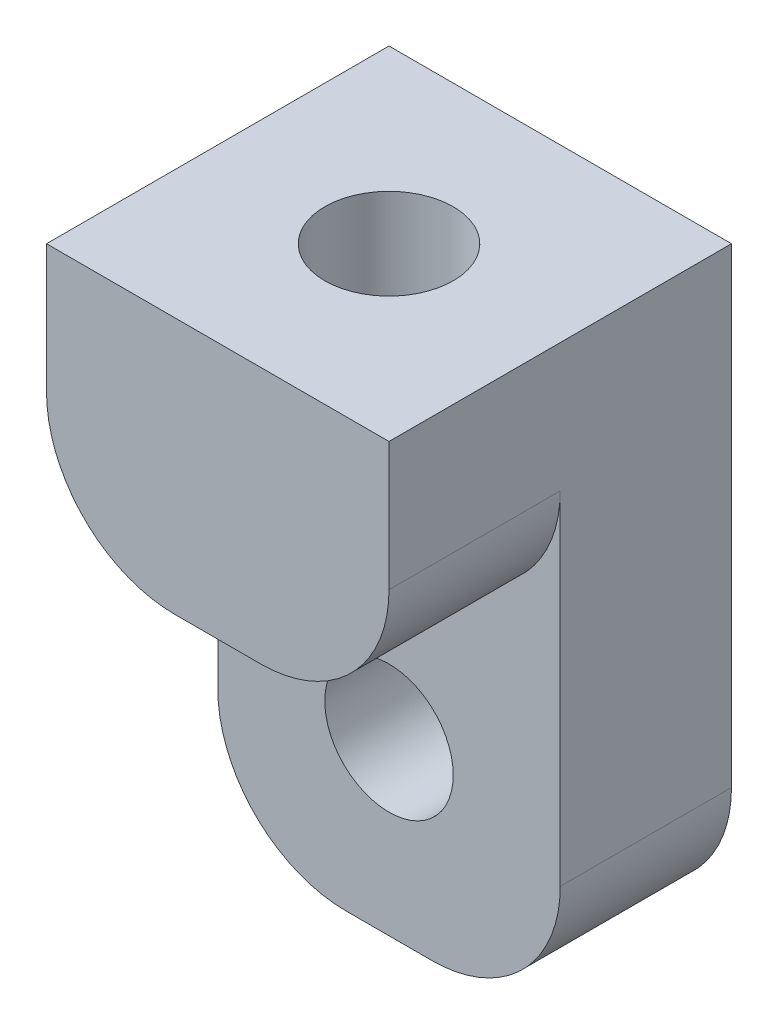
ISO-10303-21;
HEADER;
FILE_DESCRIPTION(('STEP AP214'),'2;1');
FILE_NAME('part.step','',(''),(''),'','','');
FILE_SCHEMA(('AUTOMOTIVE_DESIGN { 1 0 10303 214 1 1 1 1 }'));
ENDSEC;
DATA;
#1=APPLICATION_CONTEXT('core data for automotive mechanical design processes');
#2=APPLICATION_PROTOCOL_DEFINITION('international standard','automotive_design',2000,#1);
#3=PRODUCT_CONTEXT('',#1,'mechanical');
#4=PRODUCT('Part','Part','',(#3));
#5=PRODUCT_RELATED_PRODUCT_CATEGORY('part','',(#4));
#6=PRODUCT_DEFINITION_FORMATION('','',#4);
#7=PRODUCT_DEFINITION_CONTEXT('part definition',#1,'design');
#8=PRODUCT_DEFINITION('design','',#6,#7);
#9=PRODUCT_DEFINITION_SHAPE('','',#8);
#10=(LENGTH_UNIT() NAMED_UNIT(*) SI_UNIT(.MILLI.,.METRE.));
#11=(NAMED_UNIT(*) PLANE_ANGLE_UNIT() SI_UNIT($,.RADIAN.));
#12=(NAMED_UNIT(*) SI_UNIT($,.STERADIAN.) SOLID_ANGLE_UNIT());
#13=UNCERTAINTY_MEASURE_WITH_UNIT(LENGTH_MEASURE(1.E-05),#10,'distance_accuracy_value','');
#14=(GEOMETRIC_REPRESENTATION_CONTEXT(3) GLOBAL_UNCERTAINTY_ASSIGNED_CONTEXT((#13)) GLOBAL_UNIT_ASSIGNED_CONTEXT((#10,
#11,#12)) REPRESENTATION_CONTEXT('',''));
#15=CARTESIAN_POINT('',(0.,0.,0.));
#16=DIRECTION('',(0.,0.,1.));
#17=DIRECTION('',(1.,0.,0.));
#18=AXIS2_PLACEMENT_3D('',#15,#16,#17);
#19=CARTESIAN_POINT('',(0.,0.,40.));
#20=DIRECTION('',(0.,0.,1.));
#21=DIRECTION('',(1.,0.,0.));
#22=AXIS2_PLACEMENT_3D('',#19,#20,#21);
#23=PLANE('',#22);
#24=DIRECTION('',(0.,-1.,0.));
#25=VECTOR('',#24,1.);
#26=CARTESIAN_POINT('',(-20.,50.,40.));
#27=LINE('',#26,#25);
#28=CARTESIAN_POINT('',(-20.,50.,40.));
#29=VERTEX_POINT('',#28);
#30=CARTESIAN_POINT('',(-20.,35.,40.));
#31=VERTEX_POINT('',#30);
#32=EDGE_CURVE('E124',#29,#31,#27,.T.);
#33=ORIENTED_EDGE('',*,*,#32,.T.);
#34=CARTESIAN_POINT('',(-5.00000000000001,35.,40.));
#35=DIRECTION('',(0.,0.,1.));
#36=DIRECTION('',(1.,0.,0.));
#37=AXIS2_PLACEMENT_3D('',#34,#35,#36);
#38=CIRCLE('',#37,15.);
#39=CARTESIAN_POINT('',(-5.00000000000001,20.,40.));
#40=VERTEX_POINT('',#39);
#41=EDGE_CURVE('E163',#31,#40,#38,.T.);
#42=ORIENTED_EDGE('',*,*,#41,.T.);
#43=DIRECTION('',(1.,0.,0.));
#44=VECTOR('',#43,1.);
#45=CARTESIAN_POINT('',(-20.,20.,40.));
#46=LINE('',#45,#44);
#47=CARTESIAN_POINT('',(5.00000000000001,20.,40.));
#48=VERTEX_POINT('',#47);
#49=EDGE_CURVE('E205',#40,#48,#46,.T.);
#50=ORIENTED_EDGE('',*,*,#49,.T.);
#51=CARTESIAN_POINT('',(5.00000000000001,35.,40.));
#52=DIRECTION('',(0.,0.,1.));
#53=DIRECTION('',(1.,0.,0.));
#54=AXIS2_PLACEMENT_3D('',#51,#52,#53);
#55=CIRCLE('',#54,15.);
#56=CARTESIAN_POINT('',(20.,35.,40.));
#57=VERTEX_POINT('',#56);
#58=EDGE_CURVE('E120',#48,#57,#55,.T.);
#59=ORIENTED_EDGE('',*,*,#58,.T.);
#60=DIRECTION('',(0.,1.,0.));
#61=VECTOR('',#60,1.);
#62=CARTESIAN_POINT('',(20.,50.,40.));
#63=LINE('',#62,#61);
#64=CARTESIAN_POINT('',(20.,50.,40.));
#65=VERTEX_POINT('',#64);
#66=EDGE_CURVE('E113',#57,#65,#63,.T.);
#67=ORIENTED_EDGE('',*,*,#66,.T.);
#68=DIRECTION('',(-1.,0.,0.));
#69=VECTOR('',#68,1.);
#70=CARTESIAN_POINT('',(-20.,50.,40.));
#71=LINE('',#70,#69);
#72=EDGE_CURVE('E117',#65,#29,#71,.T.);
#73=ORIENTED_EDGE('',*,*,#72,.T.);
#74=EDGE_LOOP('',(#33,#42,#50,#59,#67,#73));
#75=FACE_BOUND('',#74,.T.);
#76=ADVANCED_FACE('F36',(#75),#23,.T.);
#77=CARTESIAN_POINT('',(-20.,50.,40.));
#78=DIRECTION('',(1.,0.,0.));
#79=DIRECTION('',(0.,1.,0.));
#80=AXIS2_PLACEMENT_3D('',#77,#78,#79);
#81=PLANE('',#80);
#82=DIRECTION('',(0.,1.,0.));
#83=VECTOR('',#82,1.);
#84=CARTESIAN_POINT('',(-20.,-20.,20.));
#85=LINE('',#84,#83);
#86=CARTESIAN_POINT('',(-20.,-5.,20.));
#87=VERTEX_POINT('',#86);
#88=CARTESIAN_POINT('',(-20.,35.,20.));
#89=VERTEX_POINT('',#88);
#90=EDGE_CURVE('E157',#87,#89,#85,.T.);
#91=ORIENTED_EDGE('',*,*,#90,.T.);
#92=DIRECTION('',(0.,0.,1.));
#93=VECTOR('',#92,1.);
#94=CARTESIAN_POINT('',(-20.,35.,40.));
#95=LINE('',#94,#93);
#96=EDGE_CURVE('E159',#89,#31,#95,.T.);
#97=ORIENTED_EDGE('',*,*,#96,.T.);
#98=ORIENTED_EDGE('',*,*,#32,.F.);
#99=DIRECTION('',(0.,0.,-1.));
#100=VECTOR('',#99,1.);
#101=CARTESIAN_POINT('',(-20.,50.,40.));
#102=LINE('',#101,#100);
#103=CARTESIAN_POINT('',(-20.,50.,0.));
#104=VERTEX_POINT('',#103);
#105=EDGE_CURVE('E135',#29,#104,#102,.T.);
#106=ORIENTED_EDGE('',*,*,#105,.T.);
#107=DIRECTION('',(0.,-1.,0.));
#108=VECTOR('',#107,1.);
#109=CARTESIAN_POINT('',(-20.,50.,0.));
#110=LINE('',#109,#108);
#111=CARTESIAN_POINT('',(-20.,-5.,0.));
#112=VERTEX_POINT('',#111);
#113=EDGE_CURVE('E144',#104,#112,#110,.T.);
#114=ORIENTED_EDGE('',*,*,#113,.T.);
#115=DIRECTION('',(0.,0.,-1.));
#116=VECTOR('',#115,1.);
#117=CARTESIAN_POINT('',(-20.,-5.,40.));
#118=LINE('',#117,#116);
#119=EDGE_CURVE('E134',#112,#87,#118,.F.);
#120=ORIENTED_EDGE('',*,*,#119,.T.);
#121=EDGE_LOOP('',(#91,#97,#98,#106,#114,#120));
#122=FACE_BOUND('',#121,.T.);
#123=ADVANCED_FACE('F195',(#122),#81,.F.);
#124=CARTESIAN_POINT('',(-20.,-20.,40.));
#125=DIRECTION('',(0.,1.,0.));
#126=DIRECTION('',(0.,0.,1.));
#127=AXIS2_PLACEMENT_3D('',#124,#125,#126);
#128=PLANE('',#127);
#129=DIRECTION('',(1.,0.,0.));
#130=VECTOR('',#129,1.);
#131=CARTESIAN_POINT('',(-20.,-20.,0.));
#132=LINE('',#131,#130);
#133=CARTESIAN_POINT('',(-5.,-20.,0.));
#134=VERTEX_POINT('',#133);
#135=CARTESIAN_POINT('',(5.,-20.,0.));
#136=VERTEX_POINT('',#135);
#137=EDGE_CURVE('E147',#134,#136,#132,.T.);
#138=ORIENTED_EDGE('',*,*,#137,.T.);
#139=DIRECTION('',(0.,0.,-1.));
#140=VECTOR('',#139,1.);
#141=CARTESIAN_POINT('',(5.,-20.,40.));
#142=LINE('',#141,#140);
#143=CARTESIAN_POINT('',(5.,-20.,20.));
#144=VERTEX_POINT('',#143);
#145=EDGE_CURVE('E51',#136,#144,#142,.F.);
#146=ORIENTED_EDGE('',*,*,#145,.T.);
#147=DIRECTION('',(1.,0.,0.));
#148=VECTOR('',#147,1.);
#149=CARTESIAN_POINT('',(-20.,-20.,20.));
#150=LINE('',#149,#148);
#151=CARTESIAN_POINT('',(-5.,-20.,20.));
#152=VERTEX_POINT('',#151);
#153=EDGE_CURVE('E207',#152,#144,#150,.T.);
#154=ORIENTED_EDGE('',*,*,#153,.F.);
#155=DIRECTION('',(0.,0.,-1.));
#156=VECTOR('',#155,1.);
#157=CARTESIAN_POINT('',(-5.,-20.,40.));
#158=LINE('',#157,#156);
#159=EDGE_CURVE('E178',#152,#134,#158,.T.);
#160=ORIENTED_EDGE('',*,*,#159,.T.);
#161=EDGE_LOOP('',(#138,#146,#154,#160));
#162=FACE_BOUND('',#161,.T.);
#163=ADVANCED_FACE('F225',(#162),#128,.F.);
#164=CARTESIAN_POINT('',(20.,50.,40.));
#165=DIRECTION('',(-1.,0.,0.));
#166=DIRECTION('',(0.,-1.,0.));
#167=AXIS2_PLACEMENT_3D('',#164,#165,#166);
#168=PLANE('',#167);
#169=ORIENTED_EDGE('',*,*,#66,.F.);
#170=DIRECTION('',(0.,0.,1.));
#171=VECTOR('',#170,1.);
#172=CARTESIAN_POINT('',(20.,35.,20.));
#173=LINE('',#172,#171);
#174=CARTESIAN_POINT('',(20.,35.,20.));
#175=VERTEX_POINT('',#174);
#176=EDGE_CURVE('E172',#57,#175,#173,.F.);
#177=ORIENTED_EDGE('',*,*,#176,.T.);
#178=DIRECTION('',(0.,1.,0.));
#179=VECTOR('',#178,1.);
#180=CARTESIAN_POINT('',(20.,-20.,20.));
#181=LINE('',#180,#179);
#182=CARTESIAN_POINT('',(20.,-5.00000000000001,20.));
#183=VERTEX_POINT('',#182);
#184=EDGE_CURVE('E210',#183,#175,#181,.T.);
#185=ORIENTED_EDGE('',*,*,#184,.F.);
#186=DIRECTION('',(0.,0.,-1.));
#187=VECTOR('',#186,1.);
#188=CARTESIAN_POINT('',(20.,-5.,40.));
#189=LINE('',#188,#187);
#190=CARTESIAN_POINT('',(20.,-5.,0.));
#191=VERTEX_POINT('',#190);
#192=EDGE_CURVE('E170',#183,#191,#189,.T.);
#193=ORIENTED_EDGE('',*,*,#192,.T.);
#194=DIRECTION('',(0.,1.,0.));
#195=VECTOR('',#194,1.);
#196=CARTESIAN_POINT('',(20.,50.,0.));
#197=LINE('',#196,#195);
#198=CARTESIAN_POINT('',(20.,50.,0.));
#199=VERTEX_POINT('',#198);
#200=EDGE_CURVE('E131',#191,#199,#197,.T.);
#201=ORIENTED_EDGE('',*,*,#200,.T.);
#202=DIRECTION('',(0.,0.,-1.));
#203=VECTOR('',#202,1.);
#204=CARTESIAN_POINT('',(20.,50.,40.));
#205=LINE('',#204,#203);
#206=EDGE_CURVE('E127',#65,#199,#205,.T.);
#207=ORIENTED_EDGE('',*,*,#206,.F.);
#208=EDGE_LOOP('',(#169,#177,#185,#193,#201,#207));
#209=FACE_BOUND('',#208,.T.);
#210=ADVANCED_FACE('F128',(#209),#168,.F.);
#211=CARTESIAN_POINT('',(0.,0.,40.));
#212=DIRECTION('',(0.,0.,-1.));
#213=DIRECTION('',(-1.,0.,0.));
#214=AXIS2_PLACEMENT_3D('',#211,#212,#213);
#215=CYLINDRICAL_SURFACE('',#214,7.5);
#216=CARTESIAN_POINT('',(0.,0.,0.));
#217=DIRECTION('',(0.,0.,1.));
#218=DIRECTION('',(1.,0.,0.));
#219=AXIS2_PLACEMENT_3D('',#216,#217,#218);
#220=CIRCLE('',#219,7.5);
#221=CARTESIAN_POINT('',(7.5,0.,0.));
#222=VERTEX_POINT('',#221);
#223=EDGE_CURVE('E148',#222,#222,#220,.T.);
#224=ORIENTED_EDGE('',*,*,#223,.F.);
#225=EDGE_LOOP('',(#224));
#226=FACE_BOUND('',#225,.T.);
#227=CARTESIAN_POINT('',(0.,0.,20.));
#228=DIRECTION('',(0.,0.,1.));
#229=DIRECTION('',(1.,0.,0.));
#230=AXIS2_PLACEMENT_3D('',#227,#228,#229);
#231=CIRCLE('',#230,7.5);
#232=CARTESIAN_POINT('',(7.5,0.,20.));
#233=VERTEX_POINT('',#232);
#234=EDGE_CURVE('E153',#233,#233,#231,.T.);
#235=ORIENTED_EDGE('',*,*,#234,.T.);
#236=EDGE_LOOP('',(#235));
#237=FACE_BOUND('',#236,.T.);
#238=ADVANCED_FACE('F232',(#226,#237),#215,.F.);
#239=CARTESIAN_POINT('',(0.,0.,0.));
#240=DIRECTION('',(0.,0.,1.));
#241=DIRECTION('',(1.,0.,0.));
#242=AXIS2_PLACEMENT_3D('',#239,#240,#241);
#243=PLANE('',#242);
#244=ORIENTED_EDGE('',*,*,#200,.F.);
#245=CARTESIAN_POINT('',(5.,-5.,0.));
#246=DIRECTION('',(0.,0.,1.));
#247=DIRECTION('',(1.,0.,0.));
#248=AXIS2_PLACEMENT_3D('',#245,#246,#247);
#249=CIRCLE('',#248,15.);
#250=EDGE_CURVE('E176',#191,#136,#249,.F.);
#251=ORIENTED_EDGE('',*,*,#250,.T.);
#252=ORIENTED_EDGE('',*,*,#137,.F.);
#253=CARTESIAN_POINT('',(-5.,-5.,0.));
#254=DIRECTION('',(0.,0.,1.));
#255=DIRECTION('',(1.,0.,0.));
#256=AXIS2_PLACEMENT_3D('',#253,#254,#255);
#257=CIRCLE('',#256,15.);
#258=EDGE_CURVE('E174',#134,#112,#257,.F.);
#259=ORIENTED_EDGE('',*,*,#258,.T.);
#260=ORIENTED_EDGE('',*,*,#113,.F.);
#261=DIRECTION('',(-1.,0.,0.));
#262=VECTOR('',#261,1.);
#263=CARTESIAN_POINT('',(-20.,50.,0.));
#264=LINE('',#263,#262);
#265=EDGE_CURVE('E151',#199,#104,#264,.T.);
#266=ORIENTED_EDGE('',*,*,#265,.F.);
#267=EDGE_LOOP('',(#244,#251,#252,#259,#260,#266));
#268=FACE_BOUND('',#267,.T.);
#269=ORIENTED_EDGE('',*,*,#223,.T.);
#270=EDGE_LOOP('',(#269));
#271=FACE_BOUND('',#270,.T.);
#272=ADVANCED_FACE('F219',(#268,#271),#243,.F.);
#273=CARTESIAN_POINT('',(-20.,50.,40.));
#274=DIRECTION('',(0.,-1.,0.));
#275=DIRECTION('',(0.,0.,-1.));
#276=AXIS2_PLACEMENT_3D('',#273,#274,#275);
#277=PLANE('',#276);
#278=CARTESIAN_POINT('',(0.,50.,20.));
#279=DIRECTION('',(0.,1.,0.));
#280=DIRECTION('',(0.,0.,1.));
#281=AXIS2_PLACEMENT_3D('',#278,#279,#280);
#282=CIRCLE('',#281,7.5);
#283=CARTESIAN_POINT('',(0.,50.,27.5));
#284=VERTEX_POINT('',#283);
#285=EDGE_CURVE('E156',#284,#284,#282,.T.);
#286=ORIENTED_EDGE('',*,*,#285,.F.);
#287=EDGE_LOOP('',(#286));
#288=FACE_BOUND('',#287,.T.);
#289=ORIENTED_EDGE('',*,*,#265,.T.);
#290=ORIENTED_EDGE('',*,*,#105,.F.);
#291=ORIENTED_EDGE('',*,*,#72,.F.);
#292=ORIENTED_EDGE('',*,*,#206,.T.);
#293=EDGE_LOOP('',(#289,#290,#291,#292));
#294=FACE_BOUND('',#293,.T.);
#295=ADVANCED_FACE('F137',(#288,#294),#277,.F.);
#296=CARTESIAN_POINT('',(0.,30.,20.));
#297=DIRECTION('',(0.,1.,0.));
#298=DIRECTION('',(0.,0.,1.));
#299=AXIS2_PLACEMENT_3D('',#296,#297,#298);
#300=CYLINDRICAL_SURFACE('',#299,7.5);
#301=CARTESIAN_POINT('',(0.,30.,20.));
#302=DIRECTION('',(0.,1.,0.));
#303=DIRECTION('',(0.,0.,1.));
#304=AXIS2_PLACEMENT_3D('',#301,#302,#303);
#305=CIRCLE('',#304,7.5);
#306=CARTESIAN_POINT('',(0.,30.,27.5));
#307=VERTEX_POINT('',#306);
#308=EDGE_CURVE('E200',#307,#307,#305,.T.);
#309=ORIENTED_EDGE('',*,*,#308,.F.);
#310=EDGE_LOOP('',(#309));
#311=FACE_BOUND('',#310,.T.);
#312=ORIENTED_EDGE('',*,*,#285,.T.);
#313=EDGE_LOOP('',(#312));
#314=FACE_BOUND('',#313,.T.);
#315=ADVANCED_FACE('F245',(#311,#314),#300,.F.);
#316=CARTESIAN_POINT('',(0.,30.,0.));
#317=DIRECTION('',(0.,1.,0.));
#318=DIRECTION('',(0.,0.,1.));
#319=AXIS2_PLACEMENT_3D('',#316,#317,#318);
#320=PLANE('',#319);
#321=ORIENTED_EDGE('',*,*,#308,.T.);
#322=EDGE_LOOP('',(#321));
#323=FACE_BOUND('',#322,.T.);
#324=ADVANCED_FACE('F250',(#323),#320,.T.);
#325=CARTESIAN_POINT('',(-20.,20.,20.));
#326=DIRECTION('',(0.,-1.,0.));
#327=DIRECTION('',(0.,0.,-1.));
#328=AXIS2_PLACEMENT_3D('',#325,#326,#327);
#329=PLANE('',#328);
#330=ORIENTED_EDGE('',*,*,#49,.F.);
#331=DIRECTION('',(0.,0.,1.));
#332=VECTOR('',#331,1.);
#333=CARTESIAN_POINT('',(-5.00000000000001,20.,20.));
#334=LINE('',#333,#332);
#335=CARTESIAN_POINT('',(-5.00000000000001,20.,20.));
#336=VERTEX_POINT('',#335);
#337=EDGE_CURVE('E168',#40,#336,#334,.F.);
#338=ORIENTED_EDGE('',*,*,#337,.T.);
#339=DIRECTION('',(1.,0.,0.));
#340=VECTOR('',#339,1.);
#341=CARTESIAN_POINT('',(-20.,20.,20.));
#342=LINE('',#341,#340);
#343=CARTESIAN_POINT('',(5.00000000000001,20.,20.));
#344=VERTEX_POINT('',#343);
#345=EDGE_CURVE('E190',#336,#344,#342,.T.);
#346=ORIENTED_EDGE('',*,*,#345,.T.);
#347=DIRECTION('',(0.,0.,1.));
#348=VECTOR('',#347,1.);
#349=CARTESIAN_POINT('',(5.00000000000001,20.,40.));
#350=LINE('',#349,#348);
#351=EDGE_CURVE('E165',#344,#48,#350,.T.);
#352=ORIENTED_EDGE('',*,*,#351,.T.);
#353=EDGE_LOOP('',(#330,#338,#346,#352));
#354=FACE_BOUND('',#353,.T.);
#355=ADVANCED_FACE('F257',(#354),#329,.T.);
#356=CARTESIAN_POINT('',(0.,0.,20.));
#357=DIRECTION('',(0.,0.,1.));
#358=DIRECTION('',(1.,0.,0.));
#359=AXIS2_PLACEMENT_3D('',#356,#357,#358);
#360=PLANE('',#359);
#361=ORIENTED_EDGE('',*,*,#234,.F.);
#362=EDGE_LOOP('',(#361));
#363=FACE_BOUND('',#362,.T.);
#364=ORIENTED_EDGE('',*,*,#153,.T.);
#365=CARTESIAN_POINT('',(5.,-5.,20.));
#366=DIRECTION('',(0.,0.,1.));
#367=DIRECTION('',(1.,0.,0.));
#368=AXIS2_PLACEMENT_3D('',#365,#366,#367);
#369=CIRCLE('',#368,15.);
#370=EDGE_CURVE('E183',#144,#183,#369,.T.);
#371=ORIENTED_EDGE('',*,*,#370,.T.);
#372=ORIENTED_EDGE('',*,*,#184,.T.);
#373=CARTESIAN_POINT('',(5.00000000000001,35.,20.));
#374=DIRECTION('',(0.,0.,1.));
#375=DIRECTION('',(1.,0.,0.));
#376=AXIS2_PLACEMENT_3D('',#373,#374,#375);
#377=CIRCLE('',#376,15.);
#378=EDGE_CURVE('E11',#175,#344,#377,.F.);
#379=ORIENTED_EDGE('',*,*,#378,.T.);
#380=ORIENTED_EDGE('',*,*,#345,.F.);
#381=CARTESIAN_POINT('',(-5.00000000000001,35.,20.));
#382=DIRECTION('',(0.,0.,1.));
#383=DIRECTION('',(1.,0.,0.));
#384=AXIS2_PLACEMENT_3D('',#381,#382,#383);
#385=CIRCLE('',#384,15.);
#386=EDGE_CURVE('E44',#336,#89,#385,.F.);
#387=ORIENTED_EDGE('',*,*,#386,.T.);
#388=ORIENTED_EDGE('',*,*,#90,.F.);
#389=CARTESIAN_POINT('',(-5.,-5.,20.));
#390=DIRECTION('',(0.,0.,1.));
#391=DIRECTION('',(1.,0.,0.));
#392=AXIS2_PLACEMENT_3D('',#389,#390,#391);
#393=CIRCLE('',#392,15.);
#394=EDGE_CURVE('E58',#87,#152,#393,.T.);
#395=ORIENTED_EDGE('',*,*,#394,.T.);
#396=EDGE_LOOP('',(#364,#371,#372,#379,#380,#387,#388,#395));
#397=FACE_BOUND('',#396,.T.);
#398=ADVANCED_FACE('F188',(#363,#397),#360,.T.);
#399=CARTESIAN_POINT('',(-5.00000000000001,35.,40.));
#400=DIRECTION('',(0.,0.,-1.));
#401=DIRECTION('',(-1.,0.,0.));
#402=AXIS2_PLACEMENT_3D('',#399,#400,#401);
#403=CYLINDRICAL_SURFACE('',#402,15.);
#404=ORIENTED_EDGE('',*,*,#386,.F.);
#405=ORIENTED_EDGE('',*,*,#337,.F.);
#406=ORIENTED_EDGE('',*,*,#41,.F.);
#407=ORIENTED_EDGE('',*,*,#96,.F.);
#408=EDGE_LOOP('',(#404,#405,#406,#407));
#409=FACE_BOUND('',#408,.T.);
#410=ADVANCED_FACE('F193',(#409),#403,.T.);
#411=CARTESIAN_POINT('',(5.00000000000001,35.,20.));
#412=DIRECTION('',(0.,0.,-1.));
#413=DIRECTION('',(-1.,0.,0.));
#414=AXIS2_PLACEMENT_3D('',#411,#412,#413);
#415=CYLINDRICAL_SURFACE('',#414,15.);
#416=ORIENTED_EDGE('',*,*,#378,.F.);
#417=ORIENTED_EDGE('',*,*,#176,.F.);
#418=ORIENTED_EDGE('',*,*,#58,.F.);
#419=ORIENTED_EDGE('',*,*,#351,.F.);
#420=EDGE_LOOP('',(#416,#417,#418,#419));
#421=FACE_BOUND('',#420,.T.);
#422=ADVANCED_FACE('F270',(#421),#415,.T.);
#423=CARTESIAN_POINT('',(5.,-5.,40.));
#424=DIRECTION('',(0.,0.,-1.));
#425=DIRECTION('',(-1.,0.,0.));
#426=AXIS2_PLACEMENT_3D('',#423,#424,#425);
#427=CYLINDRICAL_SURFACE('',#426,15.);
#428=ORIENTED_EDGE('',*,*,#370,.F.);
#429=ORIENTED_EDGE('',*,*,#145,.F.);
#430=ORIENTED_EDGE('',*,*,#250,.F.);
#431=ORIENTED_EDGE('',*,*,#192,.F.);
#432=EDGE_LOOP('',(#428,#429,#430,#431));
#433=FACE_BOUND('',#432,.T.);
#434=ADVANCED_FACE('F217',(#433),#427,.T.);
#435=CARTESIAN_POINT('',(-5.,-5.,40.));
#436=DIRECTION('',(0.,0.,-1.));
#437=DIRECTION('',(-1.,0.,0.));
#438=AXIS2_PLACEMENT_3D('',#435,#436,#437);
#439=CYLINDRICAL_SURFACE('',#438,15.);
#440=ORIENTED_EDGE('',*,*,#394,.F.);
#441=ORIENTED_EDGE('',*,*,#119,.F.);
#442=ORIENTED_EDGE('',*,*,#258,.F.);
#443=ORIENTED_EDGE('',*,*,#159,.F.);
#444=EDGE_LOOP('',(#440,#441,#442,#443));
#445=FACE_BOUND('',#444,.T.);
#446=ADVANCED_FACE('F38',(#445),#439,.T.);
#447=CLOSED_SHELL('',(#76,#123,#163,#210,#238,#272,#295,#315,#324,#355,#398,#410,#422,#434,#446));
#448=MANIFOLD_SOLID_BREP('B2',#447);
#449=ADVANCED_BREP_SHAPE_REPRESENTATION('',(#18,#448),#14);
#450=SHAPE_DEFINITION_REPRESENTATION(#9,#449);
ENDSEC;
END-ISO-10303-21;
